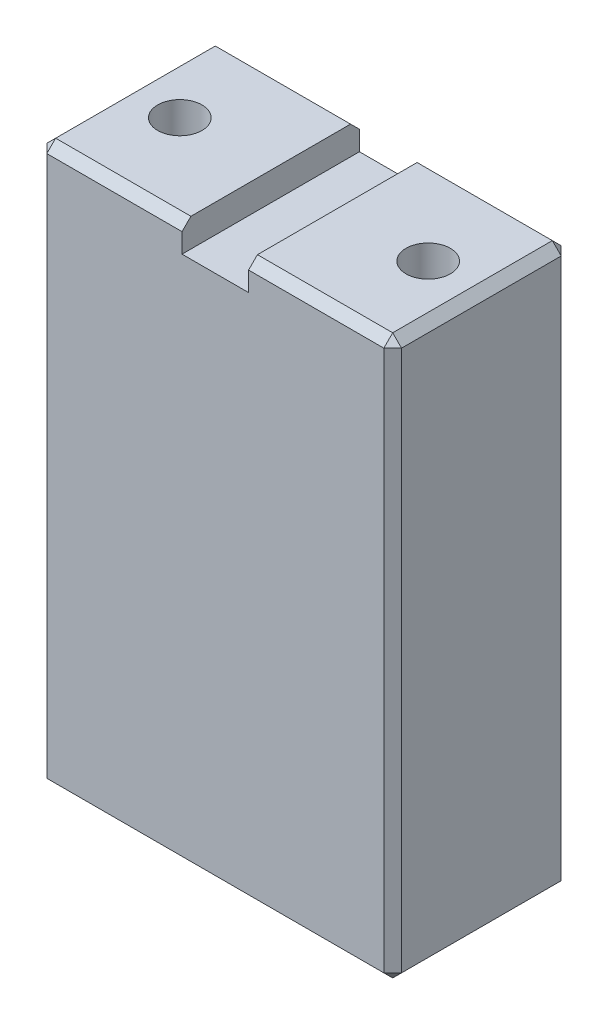
ISO-10303-21;
HEADER;
FILE_DESCRIPTION(('STEP AP214'),'2;1');
FILE_NAME('part.step','',(''),(''),'','','');
FILE_SCHEMA(('AUTOMOTIVE_DESIGN { 1 0 10303 214 1 1 1 1 }'));
ENDSEC;
DATA;
#1=APPLICATION_CONTEXT('core data for automotive mechanical design processes');
#2=APPLICATION_PROTOCOL_DEFINITION('international standard','automotive_design',2000,#1);
#3=PRODUCT_CONTEXT('',#1,'mechanical');
#4=PRODUCT('Part','Part','',(#3));
#5=PRODUCT_RELATED_PRODUCT_CATEGORY('part','',(#4));
#6=PRODUCT_DEFINITION_FORMATION('','',#4);
#7=PRODUCT_DEFINITION_CONTEXT('part definition',#1,'design');
#8=PRODUCT_DEFINITION('design','',#6,#7);
#9=PRODUCT_DEFINITION_SHAPE('','',#8);
#10=(LENGTH_UNIT() NAMED_UNIT(*) SI_UNIT(.MILLI.,.METRE.));
#11=(NAMED_UNIT(*) PLANE_ANGLE_UNIT() SI_UNIT($,.RADIAN.));
#12=(NAMED_UNIT(*) SI_UNIT($,.STERADIAN.) SOLID_ANGLE_UNIT());
#13=UNCERTAINTY_MEASURE_WITH_UNIT(LENGTH_MEASURE(1.E-05),#10,'distance_accuracy_value','');
#14=(GEOMETRIC_REPRESENTATION_CONTEXT(3) GLOBAL_UNCERTAINTY_ASSIGNED_CONTEXT((#13)) GLOBAL_UNIT_ASSIGNED_CONTEXT((#10,
#11,#12)) REPRESENTATION_CONTEXT('',''));
#15=CARTESIAN_POINT('',(0.,0.,0.));
#16=DIRECTION('',(0.,0.,1.));
#17=DIRECTION('',(1.,0.,0.));
#18=AXIS2_PLACEMENT_3D('',#15,#16,#17);
#19=CARTESIAN_POINT('',(-20.,31.5,20.));
#20=DIRECTION('',(0.,-1.,0.));
#21=DIRECTION('',(0.,0.,-1.));
#22=AXIS2_PLACEMENT_3D('',#19,#20,#21);
#23=PLANE('',#22);
#24=CARTESIAN_POINT('',(-14.,31.5,10.));
#25=DIRECTION('',(0.,1.,0.));
#26=DIRECTION('',(0.,0.,1.));
#27=AXIS2_PLACEMENT_3D('',#24,#25,#26);
#28=CIRCLE('',#27,2.5);
#29=CARTESIAN_POINT('',(-14.,31.5,12.5));
#30=VERTEX_POINT('',#29);
#31=EDGE_CURVE('E199',#30,#30,#28,.T.);
#32=ORIENTED_EDGE('',*,*,#31,.F.);
#33=EDGE_LOOP('',(#32));
#34=FACE_BOUND('',#33,.T.);
#35=DIRECTION('',(0.,0.,1.));
#36=VECTOR('',#35,1.);
#37=CARTESIAN_POINT('',(-3.75,31.5,0.));
#38=LINE('',#37,#36);
#39=CARTESIAN_POINT('',(-3.75,31.5,1.00000000000001));
#40=VERTEX_POINT('',#39);
#41=CARTESIAN_POINT('',(-3.75,31.5,19.));
#42=VERTEX_POINT('',#41);
#43=EDGE_CURVE('E221',#40,#42,#38,.T.);
#44=ORIENTED_EDGE('',*,*,#43,.F.);
#45=DIRECTION('',(-1.,0.,0.));
#46=VECTOR('',#45,1.);
#47=CARTESIAN_POINT('',(-20.,31.5,1.00000000000001));
#48=LINE('',#47,#46);
#49=CARTESIAN_POINT('',(-19.,31.5,1.00000000000001));
#50=VERTEX_POINT('',#49);
#51=EDGE_CURVE('E292',#40,#50,#48,.T.);
#52=ORIENTED_EDGE('',*,*,#51,.T.);
#53=DIRECTION('',(0.,0.,1.));
#54=VECTOR('',#53,1.);
#55=CARTESIAN_POINT('',(-19.,31.5,20.));
#56=LINE('',#55,#54);
#57=CARTESIAN_POINT('',(-19.,31.5,19.));
#58=VERTEX_POINT('',#57);
#59=EDGE_CURVE('E290',#50,#58,#56,.T.);
#60=ORIENTED_EDGE('',*,*,#59,.T.);
#61=DIRECTION('',(1.,0.,0.));
#62=VECTOR('',#61,1.);
#63=CARTESIAN_POINT('',(-20.,31.5,19.));
#64=LINE('',#63,#62);
#65=EDGE_CURVE('E288',#58,#42,#64,.T.);
#66=ORIENTED_EDGE('',*,*,#65,.T.);
#67=EDGE_LOOP('',(#44,#52,#60,#66));
#68=FACE_BOUND('',#67,.T.);
#69=ADVANCED_FACE('F53',(#34,#68),#23,.F.);
#70=CARTESIAN_POINT('',(20.,-31.5,20.));
#71=DIRECTION('',(-1.,0.,0.));
#72=DIRECTION('',(0.,0.,1.));
#73=AXIS2_PLACEMENT_3D('',#70,#71,#72);
#74=PLANE('',#73);
#75=DIRECTION('',(0.,-1.,0.));
#76=VECTOR('',#75,1.);
#77=CARTESIAN_POINT('',(20.,-31.5,19.));
#78=LINE('',#77,#76);
#79=CARTESIAN_POINT('',(20.,30.5,19.));
#80=VERTEX_POINT('',#79);
#81=CARTESIAN_POINT('',(20.,-30.5,19.));
#82=VERTEX_POINT('',#81);
#83=EDGE_CURVE('E279',#80,#82,#78,.T.);
#84=ORIENTED_EDGE('',*,*,#83,.T.);
#85=DIRECTION('',(0.,0.,-1.));
#86=VECTOR('',#85,1.);
#87=CARTESIAN_POINT('',(20.,-30.5,20.));
#88=LINE('',#87,#86);
#89=CARTESIAN_POINT('',(20.,-30.5,1.00000000000002));
#90=VERTEX_POINT('',#89);
#91=EDGE_CURVE('E285',#82,#90,#88,.T.);
#92=ORIENTED_EDGE('',*,*,#91,.T.);
#93=DIRECTION('',(0.,1.,0.));
#94=VECTOR('',#93,1.);
#95=CARTESIAN_POINT('',(20.,31.5,1.00000000000002));
#96=LINE('',#95,#94);
#97=CARTESIAN_POINT('',(20.,30.5,1.00000000000002));
#98=VERTEX_POINT('',#97);
#99=EDGE_CURVE('E283',#90,#98,#96,.T.);
#100=ORIENTED_EDGE('',*,*,#99,.T.);
#101=DIRECTION('',(0.,0.,1.));
#102=VECTOR('',#101,1.);
#103=CARTESIAN_POINT('',(20.,30.5,20.));
#104=LINE('',#103,#102);
#105=EDGE_CURVE('E281',#98,#80,#104,.T.);
#106=ORIENTED_EDGE('',*,*,#105,.T.);
#107=EDGE_LOOP('',(#84,#92,#100,#106));
#108=FACE_BOUND('',#107,.T.);
#109=ADVANCED_FACE('F392',(#108),#74,.F.);
#110=DIRECTION('',(0.,0.,-1.));
#111=VECTOR('',#110,1.);
#112=CARTESIAN_POINT('',(3.75,31.5,0.));
#113=LINE('',#112,#111);
#114=CARTESIAN_POINT('',(3.75,31.5,19.));
#115=VERTEX_POINT('',#114);
#116=CARTESIAN_POINT('',(3.75,31.5,1.00000000000001));
#117=VERTEX_POINT('',#116);
#118=EDGE_CURVE('E226',#115,#117,#113,.T.);
#119=ORIENTED_EDGE('',*,*,#118,.F.);
#120=DIRECTION('',(1.,0.,0.));
#121=VECTOR('',#120,1.);
#122=CARTESIAN_POINT('',(-20.,31.5,19.));
#123=LINE('',#122,#121);
#124=CARTESIAN_POINT('',(19.,31.5,19.));
#125=VERTEX_POINT('',#124);
#126=EDGE_CURVE('E11',#115,#125,#123,.T.);
#127=ORIENTED_EDGE('',*,*,#126,.T.);
#128=DIRECTION('',(0.,0.,-1.));
#129=VECTOR('',#128,1.);
#130=CARTESIAN_POINT('',(19.,31.5,20.));
#131=LINE('',#130,#129);
#132=CARTESIAN_POINT('',(19.,31.5,1.00000000000001));
#133=VERTEX_POINT('',#132);
#134=EDGE_CURVE('E70',#125,#133,#131,.T.);
#135=ORIENTED_EDGE('',*,*,#134,.T.);
#136=DIRECTION('',(-1.,0.,0.));
#137=VECTOR('',#136,1.);
#138=CARTESIAN_POINT('',(3.75,31.5,1.00000000000001));
#139=LINE('',#138,#137);
#140=EDGE_CURVE('E63',#133,#117,#139,.T.);
#141=ORIENTED_EDGE('',*,*,#140,.T.);
#142=EDGE_LOOP('',(#119,#127,#135,#141));
#143=FACE_BOUND('',#142,.T.);
#144=CARTESIAN_POINT('',(14.,31.5,10.));
#145=DIRECTION('',(0.,1.,0.));
#146=DIRECTION('',(0.,0.,1.));
#147=AXIS2_PLACEMENT_3D('',#144,#145,#146);
#148=CIRCLE('',#147,2.5);
#149=CARTESIAN_POINT('',(14.,31.5,12.5));
#150=VERTEX_POINT('',#149);
#151=EDGE_CURVE('E198',#150,#150,#148,.T.);
#152=ORIENTED_EDGE('',*,*,#151,.F.);
#153=EDGE_LOOP('',(#152));
#154=FACE_BOUND('',#153,.T.);
#155=ADVANCED_FACE('F418',(#143,#154),#23,.F.);
#156=CARTESIAN_POINT('',(-20.,-31.5,20.));
#157=DIRECTION('',(1.,0.,0.));
#158=DIRECTION('',(0.,0.,-1.));
#159=AXIS2_PLACEMENT_3D('',#156,#157,#158);
#160=PLANE('',#159);
#161=DIRECTION('',(0.,-1.,0.));
#162=VECTOR('',#161,1.);
#163=CARTESIAN_POINT('',(-20.,-31.5,1.00000000000001));
#164=LINE('',#163,#162);
#165=CARTESIAN_POINT('',(-20.,30.5,1.00000000000001));
#166=VERTEX_POINT('',#165);
#167=CARTESIAN_POINT('',(-20.,-30.5,1.00000000000001));
#168=VERTEX_POINT('',#167);
#169=EDGE_CURVE('E263',#166,#168,#164,.T.);
#170=ORIENTED_EDGE('',*,*,#169,.T.);
#171=DIRECTION('',(0.,0.,1.));
#172=VECTOR('',#171,1.);
#173=CARTESIAN_POINT('',(-20.,-30.5,20.));
#174=LINE('',#173,#172);
#175=CARTESIAN_POINT('',(-20.,-30.5,19.));
#176=VERTEX_POINT('',#175);
#177=EDGE_CURVE('E265',#168,#176,#174,.T.);
#178=ORIENTED_EDGE('',*,*,#177,.T.);
#179=DIRECTION('',(0.,1.,0.));
#180=VECTOR('',#179,1.);
#181=CARTESIAN_POINT('',(-20.,-31.5,19.));
#182=LINE('',#181,#180);
#183=CARTESIAN_POINT('',(-20.,30.5,19.));
#184=VERTEX_POINT('',#183);
#185=EDGE_CURVE('E259',#176,#184,#182,.T.);
#186=ORIENTED_EDGE('',*,*,#185,.T.);
#187=DIRECTION('',(0.,0.,-1.));
#188=VECTOR('',#187,1.);
#189=CARTESIAN_POINT('',(-20.,30.5,20.));
#190=LINE('',#189,#188);
#191=EDGE_CURVE('E261',#184,#166,#190,.T.);
#192=ORIENTED_EDGE('',*,*,#191,.T.);
#193=EDGE_LOOP('',(#170,#178,#186,#192));
#194=FACE_BOUND('',#193,.T.);
#195=ADVANCED_FACE('F481',(#194),#160,.F.);
#196=CARTESIAN_POINT('',(-20.,-31.5,20.));
#197=DIRECTION('',(0.,1.,0.));
#198=DIRECTION('',(0.,0.,1.));
#199=AXIS2_PLACEMENT_3D('',#196,#197,#198);
#200=PLANE('',#199);
#201=DIRECTION('',(-1.,0.,0.));
#202=VECTOR('',#201,1.);
#203=CARTESIAN_POINT('',(-20.,-31.5,19.));
#204=LINE('',#203,#202);
#205=CARTESIAN_POINT('',(19.,-31.5,19.));
#206=VERTEX_POINT('',#205);
#207=CARTESIAN_POINT('',(-19.,-31.5,19.));
#208=VERTEX_POINT('',#207);
#209=EDGE_CURVE('E242',#206,#208,#204,.T.);
#210=ORIENTED_EDGE('',*,*,#209,.T.);
#211=DIRECTION('',(0.,0.,-1.));
#212=VECTOR('',#211,1.);
#213=CARTESIAN_POINT('',(-19.,-31.5,20.));
#214=LINE('',#213,#212);
#215=CARTESIAN_POINT('',(-19.,-31.5,1.00000000000001));
#216=VERTEX_POINT('',#215);
#217=EDGE_CURVE('E256',#208,#216,#214,.T.);
#218=ORIENTED_EDGE('',*,*,#217,.T.);
#219=DIRECTION('',(1.,0.,0.));
#220=VECTOR('',#219,1.);
#221=CARTESIAN_POINT('',(20.,-31.5,1.00000000000001));
#222=LINE('',#221,#220);
#223=CARTESIAN_POINT('',(19.,-31.5,1.00000000000001));
#224=VERTEX_POINT('',#223);
#225=EDGE_CURVE('E254',#216,#224,#222,.T.);
#226=ORIENTED_EDGE('',*,*,#225,.T.);
#227=DIRECTION('',(0.,0.,1.));
#228=VECTOR('',#227,1.);
#229=CARTESIAN_POINT('',(19.,-31.5,20.));
#230=LINE('',#229,#228);
#231=EDGE_CURVE('E252',#224,#206,#230,.T.);
#232=ORIENTED_EDGE('',*,*,#231,.T.);
#233=EDGE_LOOP('',(#210,#218,#226,#232));
#234=FACE_BOUND('',#233,.T.);
#235=CARTESIAN_POINT('',(12.,-31.5,10.));
#236=DIRECTION('',(0.,-1.,0.));
#237=DIRECTION('',(0.,0.,-1.));
#238=AXIS2_PLACEMENT_3D('',#235,#236,#237);
#239=CIRCLE('',#238,3.39999999999999);
#240=CARTESIAN_POINT('',(12.,-31.5,6.60000000000002));
#241=VERTEX_POINT('',#240);
#242=EDGE_CURVE('E209',#241,#241,#239,.T.);
#243=ORIENTED_EDGE('',*,*,#242,.F.);
#244=EDGE_LOOP('',(#243));
#245=FACE_BOUND('',#244,.T.);
#246=CARTESIAN_POINT('',(-12.,-31.5,10.));
#247=DIRECTION('',(0.,-1.,0.));
#248=DIRECTION('',(0.,0.,-1.));
#249=AXIS2_PLACEMENT_3D('',#246,#247,#248);
#250=CIRCLE('',#249,3.39999999999999);
#251=CARTESIAN_POINT('',(-12.,-31.5,6.60000000000002));
#252=VERTEX_POINT('',#251);
#253=EDGE_CURVE('E215',#252,#252,#250,.T.);
#254=ORIENTED_EDGE('',*,*,#253,.F.);
#255=EDGE_LOOP('',(#254));
#256=FACE_BOUND('',#255,.T.);
#257=ADVANCED_FACE('F447',(#234,#245,#256),#200,.F.);
#258=CARTESIAN_POINT('',(0.,0.,20.));
#259=DIRECTION('',(0.,0.,-1.));
#260=DIRECTION('',(-1.,0.,0.));
#261=AXIS2_PLACEMENT_3D('',#258,#259,#260);
#262=PLANE('',#261);
#263=DIRECTION('',(0.,1.,0.));
#264=VECTOR('',#263,1.);
#265=CARTESIAN_POINT('',(-3.75,28.3,20.));
#266=LINE('',#265,#264);
#267=CARTESIAN_POINT('',(-3.75,28.3,20.));
#268=VERTEX_POINT('',#267);
#269=CARTESIAN_POINT('',(-3.75,30.5,20.));
#270=VERTEX_POINT('',#269);
#271=EDGE_CURVE('E234',#268,#270,#266,.T.);
#272=ORIENTED_EDGE('',*,*,#271,.T.);
#273=DIRECTION('',(-1.,0.,0.));
#274=VECTOR('',#273,1.);
#275=CARTESIAN_POINT('',(0.,30.5,20.));
#276=LINE('',#275,#274);
#277=CARTESIAN_POINT('',(-19.,30.5,20.));
#278=VERTEX_POINT('',#277);
#279=EDGE_CURVE('E306',#270,#278,#276,.T.);
#280=ORIENTED_EDGE('',*,*,#279,.T.);
#281=DIRECTION('',(0.,-1.,0.));
#282=VECTOR('',#281,1.);
#283=CARTESIAN_POINT('',(-19.,0.,20.));
#284=LINE('',#283,#282);
#285=CARTESIAN_POINT('',(-19.,-30.5,20.));
#286=VERTEX_POINT('',#285);
#287=EDGE_CURVE('E304',#278,#286,#284,.T.);
#288=ORIENTED_EDGE('',*,*,#287,.T.);
#289=DIRECTION('',(1.,0.,0.));
#290=VECTOR('',#289,1.);
#291=CARTESIAN_POINT('',(0.,-30.5,20.));
#292=LINE('',#291,#290);
#293=CARTESIAN_POINT('',(19.,-30.5,20.));
#294=VERTEX_POINT('',#293);
#295=EDGE_CURVE('E302',#286,#294,#292,.T.);
#296=ORIENTED_EDGE('',*,*,#295,.T.);
#297=DIRECTION('',(0.,1.,0.));
#298=VECTOR('',#297,1.);
#299=CARTESIAN_POINT('',(19.,0.,20.));
#300=LINE('',#299,#298);
#301=CARTESIAN_POINT('',(19.,30.5,20.));
#302=VERTEX_POINT('',#301);
#303=EDGE_CURVE('E298',#294,#302,#300,.T.);
#304=ORIENTED_EDGE('',*,*,#303,.T.);
#305=DIRECTION('',(-1.,0.,0.));
#306=VECTOR('',#305,1.);
#307=CARTESIAN_POINT('',(0.,30.5,20.));
#308=LINE('',#307,#306);
#309=CARTESIAN_POINT('',(3.75,30.5,20.));
#310=VERTEX_POINT('',#309);
#311=EDGE_CURVE('E300',#302,#310,#308,.T.);
#312=ORIENTED_EDGE('',*,*,#311,.T.);
#313=DIRECTION('',(0.,1.,0.));
#314=VECTOR('',#313,1.);
#315=CARTESIAN_POINT('',(3.75,28.3,20.));
#316=LINE('',#315,#314);
#317=CARTESIAN_POINT('',(3.75,28.3,20.));
#318=VERTEX_POINT('',#317);
#319=EDGE_CURVE('E246',#318,#310,#316,.T.);
#320=ORIENTED_EDGE('',*,*,#319,.F.);
#321=DIRECTION('',(1.,0.,0.));
#322=VECTOR('',#321,1.);
#323=CARTESIAN_POINT('',(-3.75,28.3,20.));
#324=LINE('',#323,#322);
#325=EDGE_CURVE('E225',#268,#318,#324,.T.);
#326=ORIENTED_EDGE('',*,*,#325,.F.);
#327=EDGE_LOOP('',(#272,#280,#288,#296,#304,#312,#320,#326));
#328=FACE_BOUND('',#327,.T.);
#329=ADVANCED_FACE('F426',(#328),#262,.F.);
#330=CARTESIAN_POINT('',(0.,0.,0.));
#331=DIRECTION('',(0.,0.,-1.));
#332=DIRECTION('',(-1.,0.,0.));
#333=AXIS2_PLACEMENT_3D('',#330,#331,#332);
#334=PLANE('',#333);
#335=DIRECTION('',(0.,1.,0.));
#336=VECTOR('',#335,1.);
#337=CARTESIAN_POINT('',(-19.,31.5,0.));
#338=LINE('',#337,#336);
#339=CARTESIAN_POINT('',(-19.,-30.5,0.));
#340=VERTEX_POINT('',#339);
#341=CARTESIAN_POINT('',(-19.,30.5,0.));
#342=VERTEX_POINT('',#341);
#343=EDGE_CURVE('E274',#340,#342,#338,.T.);
#344=ORIENTED_EDGE('',*,*,#343,.T.);
#345=DIRECTION('',(1.,0.,0.));
#346=VECTOR('',#345,1.);
#347=CARTESIAN_POINT('',(-3.75,30.5,0.));
#348=LINE('',#347,#346);
#349=CARTESIAN_POINT('',(-3.75,30.5,0.));
#350=VERTEX_POINT('',#349);
#351=EDGE_CURVE('E277',#342,#350,#348,.T.);
#352=ORIENTED_EDGE('',*,*,#351,.T.);
#353=DIRECTION('',(0.,1.,0.));
#354=VECTOR('',#353,1.);
#355=CARTESIAN_POINT('',(-3.75,28.3,0.));
#356=LINE('',#355,#354);
#357=CARTESIAN_POINT('',(-3.75,28.3,0.));
#358=VERTEX_POINT('',#357);
#359=EDGE_CURVE('E239',#358,#350,#356,.T.);
#360=ORIENTED_EDGE('',*,*,#359,.F.);
#361=DIRECTION('',(-1.,0.,0.));
#362=VECTOR('',#361,1.);
#363=CARTESIAN_POINT('',(-3.75,28.3,0.));
#364=LINE('',#363,#362);
#365=CARTESIAN_POINT('',(3.75,28.3,0.));
#366=VERTEX_POINT('',#365);
#367=EDGE_CURVE('E231',#366,#358,#364,.T.);
#368=ORIENTED_EDGE('',*,*,#367,.F.);
#369=DIRECTION('',(0.,1.,0.));
#370=VECTOR('',#369,1.);
#371=CARTESIAN_POINT('',(3.75,28.3,0.));
#372=LINE('',#371,#370);
#373=CARTESIAN_POINT('',(3.75,30.5,0.));
#374=VERTEX_POINT('',#373);
#375=EDGE_CURVE('E243',#366,#374,#372,.T.);
#376=ORIENTED_EDGE('',*,*,#375,.T.);
#377=DIRECTION('',(1.,0.,0.));
#378=VECTOR('',#377,1.);
#379=CARTESIAN_POINT('',(20.,30.5,0.));
#380=LINE('',#379,#378);
#381=CARTESIAN_POINT('',(19.,30.5,0.));
#382=VERTEX_POINT('',#381);
#383=EDGE_CURVE('E270',#374,#382,#380,.T.);
#384=ORIENTED_EDGE('',*,*,#383,.T.);
#385=DIRECTION('',(0.,-1.,0.));
#386=VECTOR('',#385,1.);
#387=CARTESIAN_POINT('',(19.,-31.5,0.));
#388=LINE('',#387,#386);
#389=CARTESIAN_POINT('',(19.,-30.5,0.));
#390=VERTEX_POINT('',#389);
#391=EDGE_CURVE('E268',#382,#390,#388,.T.);
#392=ORIENTED_EDGE('',*,*,#391,.T.);
#393=DIRECTION('',(-1.,0.,0.));
#394=VECTOR('',#393,1.);
#395=CARTESIAN_POINT('',(-20.,-30.5,0.));
#396=LINE('',#395,#394);
#397=EDGE_CURVE('E272',#390,#340,#396,.T.);
#398=ORIENTED_EDGE('',*,*,#397,.T.);
#399=EDGE_LOOP('',(#344,#352,#360,#368,#376,#384,#392,#398));
#400=FACE_BOUND('',#399,.T.);
#401=ADVANCED_FACE('F491',(#400),#334,.T.);
#402=CARTESIAN_POINT('',(-3.75,28.3,0.));
#403=DIRECTION('',(-1.,0.,0.));
#404=DIRECTION('',(0.,0.,1.));
#405=AXIS2_PLACEMENT_3D('',#402,#403,#404);
#406=PLANE('',#405);
#407=ORIENTED_EDGE('',*,*,#359,.T.);
#408=DIRECTION('',(0.,0.70710678118655,0.707106781186545));
#409=VECTOR('',#408,1.);
#410=CARTESIAN_POINT('',(-3.75,31.5,1.00000000000001));
#411=LINE('',#410,#409);
#412=EDGE_CURVE('E296',#350,#40,#411,.T.);
#413=ORIENTED_EDGE('',*,*,#412,.T.);
#414=ORIENTED_EDGE('',*,*,#43,.T.);
#415=DIRECTION('',(0.,0.707106781186545,-0.70710678118655));
#416=VECTOR('',#415,1.);
#417=CARTESIAN_POINT('',(-3.75,30.5,20.));
#418=LINE('',#417,#416);
#419=EDGE_CURVE('E294',#42,#270,#418,.F.);
#420=ORIENTED_EDGE('',*,*,#419,.T.);
#421=ORIENTED_EDGE('',*,*,#271,.F.);
#422=DIRECTION('',(0.,0.,1.));
#423=VECTOR('',#422,1.);
#424=CARTESIAN_POINT('',(-3.75,28.3,0.));
#425=LINE('',#424,#423);
#426=EDGE_CURVE('E222',#358,#268,#425,.T.);
#427=ORIENTED_EDGE('',*,*,#426,.F.);
#428=EDGE_LOOP('',(#407,#413,#414,#420,#421,#427));
#429=FACE_BOUND('',#428,.T.);
#430=ADVANCED_FACE('F494',(#429),#406,.F.);
#431=CARTESIAN_POINT('',(3.75,28.3,0.));
#432=DIRECTION('',(1.,0.,0.));
#433=DIRECTION('',(0.,0.,-1.));
#434=AXIS2_PLACEMENT_3D('',#431,#432,#433);
#435=PLANE('',#434);
#436=ORIENTED_EDGE('',*,*,#319,.T.);
#437=DIRECTION('',(0.,-0.707106781186545,0.70710678118655));
#438=VECTOR('',#437,1.);
#439=CARTESIAN_POINT('',(3.75,30.5,20.));
#440=LINE('',#439,#438);
#441=EDGE_CURVE('E310',#310,#115,#440,.F.);
#442=ORIENTED_EDGE('',*,*,#441,.T.);
#443=ORIENTED_EDGE('',*,*,#118,.T.);
#444=DIRECTION('',(0.,-0.70710678118655,-0.707106781186545));
#445=VECTOR('',#444,1.);
#446=CARTESIAN_POINT('',(3.75,31.5,1.00000000000001));
#447=LINE('',#446,#445);
#448=EDGE_CURVE('E308',#117,#374,#447,.T.);
#449=ORIENTED_EDGE('',*,*,#448,.T.);
#450=ORIENTED_EDGE('',*,*,#375,.F.);
#451=DIRECTION('',(0.,0.,-1.));
#452=VECTOR('',#451,1.);
#453=CARTESIAN_POINT('',(3.75,28.3,0.));
#454=LINE('',#453,#452);
#455=EDGE_CURVE('E229',#318,#366,#454,.T.);
#456=ORIENTED_EDGE('',*,*,#455,.F.);
#457=EDGE_LOOP('',(#436,#442,#443,#449,#450,#456));
#458=FACE_BOUND('',#457,.T.);
#459=ADVANCED_FACE('F421',(#458),#435,.F.);
#460=CARTESIAN_POINT('',(0.,28.3,0.));
#461=DIRECTION('',(0.,1.,0.));
#462=DIRECTION('',(0.,0.,1.));
#463=AXIS2_PLACEMENT_3D('',#460,#461,#462);
#464=PLANE('',#463);
#465=ORIENTED_EDGE('',*,*,#426,.T.);
#466=ORIENTED_EDGE('',*,*,#325,.T.);
#467=ORIENTED_EDGE('',*,*,#455,.T.);
#468=ORIENTED_EDGE('',*,*,#367,.T.);
#469=EDGE_LOOP('',(#465,#466,#467,#468));
#470=FACE_BOUND('',#469,.T.);
#471=ADVANCED_FACE('F503',(#470),#464,.T.);
#472=CARTESIAN_POINT('',(-12.,-11.75,10.));
#473=DIRECTION('',(0.,-1.,0.));
#474=DIRECTION('',(0.,0.,-1.));
#475=AXIS2_PLACEMENT_3D('',#472,#473,#474);
#476=CONICAL_SURFACE('',#475,3.39999999999999,1.02974425867665);
#477=CARTESIAN_POINT('',(-12.,-9.70707389530629,10.));
#478=VERTEX_POINT('',#477);
#479=VERTEX_LOOP('',#478);
#480=FACE_BOUND('',#479,.T.);
#481=CARTESIAN_POINT('',(-12.,-11.75,10.));
#482=DIRECTION('',(0.,-1.,0.));
#483=DIRECTION('',(0.,0.,-1.));
#484=AXIS2_PLACEMENT_3D('',#481,#482,#483);
#485=CIRCLE('',#484,3.39999999999999);
#486=CARTESIAN_POINT('',(-12.,-11.75,6.60000000000002));
#487=VERTEX_POINT('',#486);
#488=EDGE_CURVE('E218',#487,#487,#485,.T.);
#489=ORIENTED_EDGE('',*,*,#488,.T.);
#490=EDGE_LOOP('',(#489));
#491=FACE_BOUND('',#490,.T.);
#492=ADVANCED_FACE('F506',(#480,#491),#476,.F.);
#493=CARTESIAN_POINT('',(-12.,-31.5,10.));
#494=DIRECTION('',(0.,-1.,0.));
#495=DIRECTION('',(0.,0.,-1.));
#496=AXIS2_PLACEMENT_3D('',#493,#494,#495);
#497=CYLINDRICAL_SURFACE('',#496,3.39999999999999);
#498=ORIENTED_EDGE('',*,*,#488,.F.);
#499=EDGE_LOOP('',(#498));
#500=FACE_BOUND('',#499,.T.);
#501=ORIENTED_EDGE('',*,*,#253,.T.);
#502=EDGE_LOOP('',(#501));
#503=FACE_BOUND('',#502,.T.);
#504=ADVANCED_FACE('F510',(#500,#503),#497,.F.);
#505=CARTESIAN_POINT('',(12.,-11.75,10.));
#506=DIRECTION('',(0.,-1.,0.));
#507=DIRECTION('',(0.,0.,-1.));
#508=AXIS2_PLACEMENT_3D('',#505,#506,#507);
#509=CONICAL_SURFACE('',#508,3.39999999999999,1.02974425867665);
#510=CARTESIAN_POINT('',(12.,-9.70707389530629,10.));
#511=VERTEX_POINT('',#510);
#512=VERTEX_LOOP('',#511);
#513=FACE_BOUND('',#512,.T.);
#514=CARTESIAN_POINT('',(12.,-11.75,10.));
#515=DIRECTION('',(0.,-1.,0.));
#516=DIRECTION('',(0.,0.,-1.));
#517=AXIS2_PLACEMENT_3D('',#514,#515,#516);
#518=CIRCLE('',#517,3.39999999999999);
#519=CARTESIAN_POINT('',(12.,-11.75,6.60000000000002));
#520=VERTEX_POINT('',#519);
#521=EDGE_CURVE('E212',#520,#520,#518,.T.);
#522=ORIENTED_EDGE('',*,*,#521,.T.);
#523=EDGE_LOOP('',(#522));
#524=FACE_BOUND('',#523,.T.);
#525=ADVANCED_FACE('F514',(#513,#524),#509,.F.);
#526=CARTESIAN_POINT('',(12.,-31.5,10.));
#527=DIRECTION('',(0.,-1.,0.));
#528=DIRECTION('',(0.,0.,-1.));
#529=AXIS2_PLACEMENT_3D('',#526,#527,#528);
#530=CYLINDRICAL_SURFACE('',#529,3.39999999999999);
#531=ORIENTED_EDGE('',*,*,#521,.F.);
#532=EDGE_LOOP('',(#531));
#533=FACE_BOUND('',#532,.T.);
#534=ORIENTED_EDGE('',*,*,#242,.T.);
#535=EDGE_LOOP('',(#534));
#536=FACE_BOUND('',#535,.T.);
#537=ADVANCED_FACE('F518',(#533,#536),#530,.F.);
#538=CARTESIAN_POINT('',(14.,16.5,10.));
#539=DIRECTION('',(0.,1.,0.));
#540=DIRECTION('',(0.,0.,1.));
#541=AXIS2_PLACEMENT_3D('',#538,#539,#540);
#542=CONICAL_SURFACE('',#541,2.5,1.02974425867665);
#543=CARTESIAN_POINT('',(14.,14.9978484524311,10.));
#544=VERTEX_POINT('',#543);
#545=VERTEX_LOOP('',#544);
#546=FACE_BOUND('',#545,.T.);
#547=CARTESIAN_POINT('',(14.,16.5,10.));
#548=DIRECTION('',(0.,1.,0.));
#549=DIRECTION('',(0.,0.,1.));
#550=AXIS2_PLACEMENT_3D('',#547,#548,#549);
#551=CIRCLE('',#550,2.5);
#552=CARTESIAN_POINT('',(14.,16.5,12.5));
#553=VERTEX_POINT('',#552);
#554=EDGE_CURVE('E202',#553,#553,#551,.T.);
#555=ORIENTED_EDGE('',*,*,#554,.T.);
#556=EDGE_LOOP('',(#555));
#557=FACE_BOUND('',#556,.T.);
#558=ADVANCED_FACE('F522',(#546,#557),#542,.F.);
#559=CARTESIAN_POINT('',(14.,31.5,10.));
#560=DIRECTION('',(0.,1.,0.));
#561=DIRECTION('',(0.,0.,1.));
#562=AXIS2_PLACEMENT_3D('',#559,#560,#561);
#563=CYLINDRICAL_SURFACE('',#562,2.5);
#564=ORIENTED_EDGE('',*,*,#554,.F.);
#565=EDGE_LOOP('',(#564));
#566=FACE_BOUND('',#565,.T.);
#567=ORIENTED_EDGE('',*,*,#151,.T.);
#568=EDGE_LOOP('',(#567));
#569=FACE_BOUND('',#568,.T.);
#570=ADVANCED_FACE('F192',(#566,#569),#563,.F.);
#571=CARTESIAN_POINT('',(-14.,16.5,10.));
#572=DIRECTION('',(0.,1.,0.));
#573=DIRECTION('',(0.,0.,1.));
#574=AXIS2_PLACEMENT_3D('',#571,#572,#573);
#575=CONICAL_SURFACE('',#574,2.5,1.02974425867665);
#576=CARTESIAN_POINT('',(-14.,14.9978484524311,10.));
#577=VERTEX_POINT('',#576);
#578=VERTEX_LOOP('',#577);
#579=FACE_BOUND('',#578,.T.);
#580=CARTESIAN_POINT('',(-14.,16.5,10.));
#581=DIRECTION('',(0.,1.,0.));
#582=DIRECTION('',(0.,0.,1.));
#583=AXIS2_PLACEMENT_3D('',#580,#581,#582);
#584=CIRCLE('',#583,2.5);
#585=CARTESIAN_POINT('',(-14.,16.5,12.5));
#586=VERTEX_POINT('',#585);
#587=EDGE_CURVE('E196',#586,#586,#584,.T.);
#588=ORIENTED_EDGE('',*,*,#587,.T.);
#589=EDGE_LOOP('',(#588));
#590=FACE_BOUND('',#589,.T.);
#591=ADVANCED_FACE('F188',(#579,#590),#575,.F.);
#592=CARTESIAN_POINT('',(-14.,31.5,10.));
#593=DIRECTION('',(0.,1.,0.));
#594=DIRECTION('',(0.,0.,1.));
#595=AXIS2_PLACEMENT_3D('',#592,#593,#594);
#596=CYLINDRICAL_SURFACE('',#595,2.5);
#597=ORIENTED_EDGE('',*,*,#587,.F.);
#598=EDGE_LOOP('',(#597));
#599=FACE_BOUND('',#598,.T.);
#600=ORIENTED_EDGE('',*,*,#31,.T.);
#601=EDGE_LOOP('',(#600));
#602=FACE_BOUND('',#601,.T.);
#603=ADVANCED_FACE('F191',(#599,#602),#596,.F.);
#604=CARTESIAN_POINT('',(0.,30.5,20.));
#605=DIRECTION('',(0.,-0.70710678118655,-0.707106781186545));
#606=DIRECTION('',(-1.,0.,0.));
#607=AXIS2_PLACEMENT_3D('',#604,#605,#606);
#608=PLANE('',#607);
#609=ORIENTED_EDGE('',*,*,#441,.F.);
#610=ORIENTED_EDGE('',*,*,#311,.F.);
#611=DIRECTION('',(0.,0.707106781186545,-0.70710678118655));
#612=VECTOR('',#611,1.);
#613=CARTESIAN_POINT('',(19.,31.5,19.));
#614=LINE('',#613,#612);
#615=EDGE_CURVE('E58',#125,#302,#614,.F.);
#616=ORIENTED_EDGE('',*,*,#615,.F.);
#617=ORIENTED_EDGE('',*,*,#126,.F.);
#618=EDGE_LOOP('',(#609,#610,#616,#617));
#619=FACE_BOUND('',#618,.T.);
#620=ADVANCED_FACE('F56',(#619),#608,.F.);
#621=CARTESIAN_POINT('',(19.,31.5,20.));
#622=DIRECTION('',(-0.707106781186551,-0.707106781186544,0.));
#623=DIRECTION('',(0.,0.,-1.));
#624=AXIS2_PLACEMENT_3D('',#621,#622,#623);
#625=PLANE('',#624);
#626=DIRECTION('',(-0.707106781186544,0.707106781186551,0.));
#627=VECTOR('',#626,1.);
#628=CARTESIAN_POINT('',(19.5,31.,1.00000000000002));
#629=LINE('',#628,#627);
#630=EDGE_CURVE('E373',#133,#98,#629,.F.);
#631=ORIENTED_EDGE('',*,*,#630,.F.);
#632=ORIENTED_EDGE('',*,*,#134,.F.);
#633=DIRECTION('',(0.707106781186544,-0.707106781186551,0.));
#634=VECTOR('',#633,1.);
#635=CARTESIAN_POINT('',(19.,31.5,19.));
#636=LINE('',#635,#634);
#637=EDGE_CURVE('E375',#80,#125,#636,.F.);
#638=ORIENTED_EDGE('',*,*,#637,.F.);
#639=ORIENTED_EDGE('',*,*,#105,.F.);
#640=EDGE_LOOP('',(#631,#632,#638,#639));
#641=FACE_BOUND('',#640,.T.);
#642=ADVANCED_FACE('F410',(#641),#625,.F.);
#643=CARTESIAN_POINT('',(-20.,31.5,1.00000000000001));
#644=DIRECTION('',(0.,0.707106781186545,-0.70710678118655));
#645=DIRECTION('',(1.,0.,0.));
#646=AXIS2_PLACEMENT_3D('',#643,#644,#645);
#647=PLANE('',#646);
#648=ORIENTED_EDGE('',*,*,#448,.F.);
#649=ORIENTED_EDGE('',*,*,#140,.F.);
#650=DIRECTION('',(0.,0.70710678118655,0.707106781186545));
#651=VECTOR('',#650,1.);
#652=CARTESIAN_POINT('',(19.,30.5,0.));
#653=LINE('',#652,#651);
#654=EDGE_CURVE('E370',#382,#133,#653,.T.);
#655=ORIENTED_EDGE('',*,*,#654,.F.);
#656=ORIENTED_EDGE('',*,*,#383,.F.);
#657=EDGE_LOOP('',(#648,#649,#655,#656));
#658=FACE_BOUND('',#657,.T.);
#659=ADVANCED_FACE('F417',(#658),#647,.T.);
#660=CARTESIAN_POINT('',(19.,31.5,19.));
#661=DIRECTION('',(0.577350269189631,0.577350269189625,0.577350269189622));
#662=DIRECTION('',(-0.707106781186544,0.707106781186551,0.));
#663=AXIS2_PLACEMENT_3D('',#660,#661,#662);
#664=PLANE('',#663);
#665=ORIENTED_EDGE('',*,*,#637,.T.);
#666=ORIENTED_EDGE('',*,*,#615,.T.);
#667=DIRECTION('',(-0.707106781186545,0.,0.70710678118655));
#668=VECTOR('',#667,1.);
#669=CARTESIAN_POINT('',(19.5,30.5,19.5));
#670=LINE('',#669,#668);
#671=EDGE_CURVE('E367',#80,#302,#670,.T.);
#672=ORIENTED_EDGE('',*,*,#671,.F.);
#673=EDGE_LOOP('',(#665,#666,#672));
#674=FACE_BOUND('',#673,.T.);
#675=ADVANCED_FACE('F382',(#674),#664,.T.);
#676=CARTESIAN_POINT('',(19.,30.5,0.));
#677=DIRECTION('',(0.577350269189631,0.577350269189621,-0.577350269189626));
#678=DIRECTION('',(-0.707106781186545,0.,-0.70710678118655));
#679=AXIS2_PLACEMENT_3D('',#676,#677,#678);
#680=PLANE('',#679);
#681=ORIENTED_EDGE('',*,*,#654,.T.);
#682=ORIENTED_EDGE('',*,*,#630,.T.);
#683=DIRECTION('',(-0.707106781186545,0.,-0.70710678118655));
#684=VECTOR('',#683,1.);
#685=CARTESIAN_POINT('',(19.,30.5,0.));
#686=LINE('',#685,#684);
#687=EDGE_CURVE('E364',#382,#98,#686,.F.);
#688=ORIENTED_EDGE('',*,*,#687,.F.);
#689=EDGE_LOOP('',(#681,#682,#688));
#690=FACE_BOUND('',#689,.T.);
#691=ADVANCED_FACE('F412',(#690),#680,.T.);
#692=CARTESIAN_POINT('',(0.,30.5,20.));
#693=DIRECTION('',(0.,-0.70710678118655,-0.707106781186545));
#694=DIRECTION('',(-1.,0.,0.));
#695=AXIS2_PLACEMENT_3D('',#692,#693,#694);
#696=PLANE('',#695);
#697=ORIENTED_EDGE('',*,*,#419,.F.);
#698=ORIENTED_EDGE('',*,*,#65,.F.);
#699=DIRECTION('',(0.,-0.707106781186545,0.70710678118655));
#700=VECTOR('',#699,1.);
#701=CARTESIAN_POINT('',(-19.,31.5,19.));
#702=LINE('',#701,#700);
#703=EDGE_CURVE('E358',#278,#58,#702,.F.);
#704=ORIENTED_EDGE('',*,*,#703,.F.);
#705=ORIENTED_EDGE('',*,*,#279,.F.);
#706=EDGE_LOOP('',(#697,#698,#704,#705));
#707=FACE_BOUND('',#706,.T.);
#708=ADVANCED_FACE('F560',(#707),#696,.F.);
#709=CARTESIAN_POINT('',(19.,0.,20.));
#710=DIRECTION('',(-0.70710678118655,0.,-0.707106781186545));
#711=DIRECTION('',(0.,1.,0.));
#712=AXIS2_PLACEMENT_3D('',#709,#710,#711);
#713=PLANE('',#712);
#714=ORIENTED_EDGE('',*,*,#671,.T.);
#715=ORIENTED_EDGE('',*,*,#303,.F.);
#716=DIRECTION('',(0.707106781186545,0.,-0.70710678118655));
#717=VECTOR('',#716,1.);
#718=CARTESIAN_POINT('',(19.5,-30.5,19.5));
#719=LINE('',#718,#717);
#720=EDGE_CURVE('E355',#82,#294,#719,.F.);
#721=ORIENTED_EDGE('',*,*,#720,.F.);
#722=ORIENTED_EDGE('',*,*,#83,.F.);
#723=EDGE_LOOP('',(#714,#715,#721,#722));
#724=FACE_BOUND('',#723,.T.);
#725=ADVANCED_FACE('F388',(#724),#713,.F.);
#726=CARTESIAN_POINT('',(20.,-30.5,20.));
#727=DIRECTION('',(-0.707106781186551,0.707106781186544,0.));
#728=DIRECTION('',(0.,0.,-1.));
#729=AXIS2_PLACEMENT_3D('',#726,#727,#728);
#730=PLANE('',#729);
#731=DIRECTION('',(0.707106781186544,0.707106781186551,0.));
#732=VECTOR('',#731,1.);
#733=CARTESIAN_POINT('',(19.,-31.5,1.00000000000001));
#734=LINE('',#733,#732);
#735=EDGE_CURVE('E349',#90,#224,#734,.F.);
#736=ORIENTED_EDGE('',*,*,#735,.F.);
#737=ORIENTED_EDGE('',*,*,#91,.F.);
#738=DIRECTION('',(-0.707106781186544,-0.707106781186551,0.));
#739=VECTOR('',#738,1.);
#740=CARTESIAN_POINT('',(19.,-31.5,19.));
#741=LINE('',#740,#739);
#742=EDGE_CURVE('E352',#206,#82,#741,.F.);
#743=ORIENTED_EDGE('',*,*,#742,.F.);
#744=ORIENTED_EDGE('',*,*,#231,.F.);
#745=EDGE_LOOP('',(#736,#737,#743,#744));
#746=FACE_BOUND('',#745,.T.);
#747=ADVANCED_FACE('F397',(#746),#730,.F.);
#748=CARTESIAN_POINT('',(20.,-31.5,1.00000000000002));
#749=DIRECTION('',(0.70710678118655,0.,-0.707106781186545));
#750=DIRECTION('',(0.,-1.,0.));
#751=AXIS2_PLACEMENT_3D('',#748,#749,#750);
#752=PLANE('',#751);
#753=ORIENTED_EDGE('',*,*,#687,.T.);
#754=ORIENTED_EDGE('',*,*,#99,.F.);
#755=DIRECTION('',(0.707106781186545,0.,0.70710678118655));
#756=VECTOR('',#755,1.);
#757=CARTESIAN_POINT('',(19.5,-30.5,0.500000000000012));
#758=LINE('',#757,#756);
#759=EDGE_CURVE('E347',#390,#90,#758,.T.);
#760=ORIENTED_EDGE('',*,*,#759,.F.);
#761=ORIENTED_EDGE('',*,*,#391,.F.);
#762=EDGE_LOOP('',(#753,#754,#760,#761));
#763=FACE_BOUND('',#762,.T.);
#764=ADVANCED_FACE('F405',(#763),#752,.T.);
#765=CARTESIAN_POINT('',(-20.,31.5,1.00000000000001));
#766=DIRECTION('',(0.,0.707106781186545,-0.70710678118655));
#767=DIRECTION('',(1.,0.,0.));
#768=AXIS2_PLACEMENT_3D('',#765,#766,#767);
#769=PLANE('',#768);
#770=ORIENTED_EDGE('',*,*,#412,.F.);
#771=ORIENTED_EDGE('',*,*,#351,.F.);
#772=DIRECTION('',(0.,-0.70710678118655,-0.707106781186545));
#773=VECTOR('',#772,1.);
#774=CARTESIAN_POINT('',(-19.,30.5,0.));
#775=LINE('',#774,#773);
#776=EDGE_CURVE('E344',#50,#342,#775,.T.);
#777=ORIENTED_EDGE('',*,*,#776,.F.);
#778=ORIENTED_EDGE('',*,*,#51,.F.);
#779=EDGE_LOOP('',(#770,#771,#777,#778));
#780=FACE_BOUND('',#779,.T.);
#781=ADVANCED_FACE('F582',(#780),#769,.T.);
#782=CARTESIAN_POINT('',(-20.,30.5,20.));
#783=DIRECTION('',(0.707106781186545,-0.70710678118655,0.));
#784=DIRECTION('',(0.,0.,-1.));
#785=AXIS2_PLACEMENT_3D('',#782,#783,#784);
#786=PLANE('',#785);
#787=DIRECTION('',(0.70710678118655,0.707106781186545,0.));
#788=VECTOR('',#787,1.);
#789=CARTESIAN_POINT('',(-19.,31.5,19.));
#790=LINE('',#789,#788);
#791=EDGE_CURVE('E361',#58,#184,#790,.F.);
#792=ORIENTED_EDGE('',*,*,#791,.F.);
#793=ORIENTED_EDGE('',*,*,#59,.F.);
#794=DIRECTION('',(-0.70710678118655,-0.707106781186545,0.));
#795=VECTOR('',#794,1.);
#796=CARTESIAN_POINT('',(-19.5,31.,1.00000000000001));
#797=LINE('',#796,#795);
#798=EDGE_CURVE('E341',#166,#50,#797,.F.);
#799=ORIENTED_EDGE('',*,*,#798,.F.);
#800=ORIENTED_EDGE('',*,*,#191,.F.);
#801=EDGE_LOOP('',(#792,#793,#799,#800));
#802=FACE_BOUND('',#801,.T.);
#803=ADVANCED_FACE('F588',(#802),#786,.F.);
#804=CARTESIAN_POINT('',(-19.,31.5,19.));
#805=DIRECTION('',(-0.577350269189626,0.57735026918963,0.577350269189622));
#806=DIRECTION('',(-0.70710678118655,-0.707106781186545,0.));
#807=AXIS2_PLACEMENT_3D('',#804,#805,#806);
#808=PLANE('',#807);
#809=ORIENTED_EDGE('',*,*,#703,.T.);
#810=ORIENTED_EDGE('',*,*,#791,.T.);
#811=DIRECTION('',(-0.707106781186545,0.,-0.70710678118655));
#812=VECTOR('',#811,1.);
#813=CARTESIAN_POINT('',(-19.5,30.5,19.5));
#814=LINE('',#813,#812);
#815=EDGE_CURVE('E338',#278,#184,#814,.T.);
#816=ORIENTED_EDGE('',*,*,#815,.F.);
#817=EDGE_LOOP('',(#809,#810,#816));
#818=FACE_BOUND('',#817,.T.);
#819=ADVANCED_FACE('F465',(#818),#808,.T.);
#820=CARTESIAN_POINT('',(19.,-31.5,19.));
#821=DIRECTION('',(0.577350269189631,-0.577350269189625,0.577350269189622));
#822=DIRECTION('',(0.707106781186544,0.707106781186551,0.));
#823=AXIS2_PLACEMENT_3D('',#820,#821,#822);
#824=PLANE('',#823);
#825=ORIENTED_EDGE('',*,*,#742,.T.);
#826=ORIENTED_EDGE('',*,*,#720,.T.);
#827=DIRECTION('',(0.,0.707106781186545,0.70710678118655));
#828=VECTOR('',#827,1.);
#829=CARTESIAN_POINT('',(19.,-31.5,19.));
#830=LINE('',#829,#828);
#831=EDGE_CURVE('E335',#206,#294,#830,.T.);
#832=ORIENTED_EDGE('',*,*,#831,.F.);
#833=EDGE_LOOP('',(#825,#826,#832));
#834=FACE_BOUND('',#833,.T.);
#835=ADVANCED_FACE('F457',(#834),#824,.T.);
#836=CARTESIAN_POINT('',(19.,-31.5,1.00000000000001));
#837=DIRECTION('',(0.577350269189631,-0.57735026918962,-0.577350269189626));
#838=DIRECTION('',(-0.707106781186545,0.,-0.70710678118655));
#839=AXIS2_PLACEMENT_3D('',#836,#837,#838);
#840=PLANE('',#839);
#841=ORIENTED_EDGE('',*,*,#759,.T.);
#842=ORIENTED_EDGE('',*,*,#735,.T.);
#843=DIRECTION('',(0.,0.70710678118655,-0.707106781186545));
#844=VECTOR('',#843,1.);
#845=CARTESIAN_POINT('',(19.,-31.5,1.00000000000001));
#846=LINE('',#845,#844);
#847=EDGE_CURVE('E332',#390,#224,#846,.F.);
#848=ORIENTED_EDGE('',*,*,#847,.F.);
#849=EDGE_LOOP('',(#841,#842,#848));
#850=FACE_BOUND('',#849,.T.);
#851=ADVANCED_FACE('F454',(#850),#840,.T.);
#852=CARTESIAN_POINT('',(-19.,30.5,0.));
#853=DIRECTION('',(-0.577350269189622,0.577350269189626,-0.57735026918963));
#854=DIRECTION('',(0.,0.70710678118655,0.707106781186545));
#855=AXIS2_PLACEMENT_3D('',#852,#853,#854);
#856=PLANE('',#855);
#857=ORIENTED_EDGE('',*,*,#798,.T.);
#858=ORIENTED_EDGE('',*,*,#776,.T.);
#859=DIRECTION('',(-0.70710678118655,0.,0.707106781186545));
#860=VECTOR('',#859,1.);
#861=CARTESIAN_POINT('',(-19.,30.5,0.));
#862=LINE('',#861,#860);
#863=EDGE_CURVE('E330',#166,#342,#862,.F.);
#864=ORIENTED_EDGE('',*,*,#863,.F.);
#865=EDGE_LOOP('',(#857,#858,#864));
#866=FACE_BOUND('',#865,.T.);
#867=ADVANCED_FACE('F456',(#866),#856,.T.);
#868=CARTESIAN_POINT('',(-19.,0.,20.));
#869=DIRECTION('',(0.70710678118655,0.,-0.707106781186545));
#870=DIRECTION('',(0.,-1.,0.));
#871=AXIS2_PLACEMENT_3D('',#868,#869,#870);
#872=PLANE('',#871);
#873=ORIENTED_EDGE('',*,*,#815,.T.);
#874=ORIENTED_EDGE('',*,*,#185,.F.);
#875=DIRECTION('',(0.707106781186545,0.,0.70710678118655));
#876=VECTOR('',#875,1.);
#877=CARTESIAN_POINT('',(-20.,-30.5,19.));
#878=LINE('',#877,#876);
#879=EDGE_CURVE('E327',#286,#176,#878,.F.);
#880=ORIENTED_EDGE('',*,*,#879,.F.);
#881=ORIENTED_EDGE('',*,*,#287,.F.);
#882=EDGE_LOOP('',(#873,#874,#880,#881));
#883=FACE_BOUND('',#882,.T.);
#884=ADVANCED_FACE('F438',(#883),#872,.F.);
#885=CARTESIAN_POINT('',(0.,-30.5,20.));
#886=DIRECTION('',(0.,0.70710678118655,-0.707106781186545));
#887=DIRECTION('',(1.,0.,0.));
#888=AXIS2_PLACEMENT_3D('',#885,#886,#887);
#889=PLANE('',#888);
#890=ORIENTED_EDGE('',*,*,#831,.T.);
#891=ORIENTED_EDGE('',*,*,#295,.F.);
#892=DIRECTION('',(0.,-0.707106781186545,-0.70710678118655));
#893=VECTOR('',#892,1.);
#894=CARTESIAN_POINT('',(-19.,-31.,19.5));
#895=LINE('',#894,#893);
#896=EDGE_CURVE('E324',#208,#286,#895,.F.);
#897=ORIENTED_EDGE('',*,*,#896,.F.);
#898=ORIENTED_EDGE('',*,*,#209,.F.);
#899=EDGE_LOOP('',(#890,#891,#897,#898));
#900=FACE_BOUND('',#899,.T.);
#901=ADVANCED_FACE('F433',(#900),#889,.F.);
#902=CARTESIAN_POINT('',(-20.,-31.5,1.00000000000001));
#903=DIRECTION('',(0.,-0.707106781186545,-0.70710678118655));
#904=DIRECTION('',(-1.,0.,0.));
#905=AXIS2_PLACEMENT_3D('',#902,#903,#904);
#906=PLANE('',#905);
#907=ORIENTED_EDGE('',*,*,#847,.T.);
#908=ORIENTED_EDGE('',*,*,#225,.F.);
#909=DIRECTION('',(0.,-0.70710678118655,0.707106781186545));
#910=VECTOR('',#909,1.);
#911=CARTESIAN_POINT('',(-19.,-31.5,1.00000000000001));
#912=LINE('',#911,#910);
#913=EDGE_CURVE('E321',#340,#216,#912,.T.);
#914=ORIENTED_EDGE('',*,*,#913,.F.);
#915=ORIENTED_EDGE('',*,*,#397,.F.);
#916=EDGE_LOOP('',(#907,#908,#914,#915));
#917=FACE_BOUND('',#916,.T.);
#918=ADVANCED_FACE('F452',(#917),#906,.T.);
#919=CARTESIAN_POINT('',(-20.,-31.5,1.00000000000001));
#920=DIRECTION('',(-0.707106781186545,0.,-0.70710678118655));
#921=DIRECTION('',(0.,1.,0.));
#922=AXIS2_PLACEMENT_3D('',#919,#920,#921);
#923=PLANE('',#922);
#924=ORIENTED_EDGE('',*,*,#863,.T.);
#925=ORIENTED_EDGE('',*,*,#343,.F.);
#926=DIRECTION('',(0.70710678118655,0.,-0.707106781186545));
#927=VECTOR('',#926,1.);
#928=CARTESIAN_POINT('',(-19.5,-30.5,0.500000000000007));
#929=LINE('',#928,#927);
#930=EDGE_CURVE('E318',#168,#340,#929,.T.);
#931=ORIENTED_EDGE('',*,*,#930,.F.);
#932=ORIENTED_EDGE('',*,*,#169,.F.);
#933=EDGE_LOOP('',(#924,#925,#931,#932));
#934=FACE_BOUND('',#933,.T.);
#935=ADVANCED_FACE('F625',(#934),#923,.T.);
#936=CARTESIAN_POINT('',(-20.,-30.5,19.));
#937=DIRECTION('',(-0.57735026918963,-0.577350269189626,0.577350269189622));
#938=DIRECTION('',(0.707106781186545,-0.70710678118655,0.));
#939=AXIS2_PLACEMENT_3D('',#936,#937,#938);
#940=PLANE('',#939);
#941=ORIENTED_EDGE('',*,*,#896,.T.);
#942=ORIENTED_EDGE('',*,*,#879,.T.);
#943=DIRECTION('',(-0.707106781186545,0.70710678118655,0.));
#944=VECTOR('',#943,1.);
#945=CARTESIAN_POINT('',(-20.,-30.5,19.));
#946=LINE('',#945,#944);
#947=EDGE_CURVE('E316',#208,#176,#946,.T.);
#948=ORIENTED_EDGE('',*,*,#947,.F.);
#949=EDGE_LOOP('',(#941,#942,#948));
#950=FACE_BOUND('',#949,.T.);
#951=ADVANCED_FACE('F440',(#950),#940,.T.);
#952=CARTESIAN_POINT('',(-19.,-31.5,1.00000000000001));
#953=DIRECTION('',(-0.577350269189626,-0.577350269189622,-0.57735026918963));
#954=DIRECTION('',(-0.70710678118655,0.,0.707106781186545));
#955=AXIS2_PLACEMENT_3D('',#952,#953,#954);
#956=PLANE('',#955);
#957=ORIENTED_EDGE('',*,*,#930,.T.);
#958=ORIENTED_EDGE('',*,*,#913,.T.);
#959=DIRECTION('',(0.707106781186545,-0.70710678118655,0.));
#960=VECTOR('',#959,1.);
#961=CARTESIAN_POINT('',(-19.,-31.5,1.00000000000001));
#962=LINE('',#961,#960);
#963=EDGE_CURVE('E314',#168,#216,#962,.T.);
#964=ORIENTED_EDGE('',*,*,#963,.F.);
#965=EDGE_LOOP('',(#957,#958,#964));
#966=FACE_BOUND('',#965,.T.);
#967=ADVANCED_FACE('F634',(#966),#956,.T.);
#968=CARTESIAN_POINT('',(-19.,-31.5,20.));
#969=DIRECTION('',(0.70710678118655,0.707106781186545,0.));
#970=DIRECTION('',(0.,0.,-1.));
#971=AXIS2_PLACEMENT_3D('',#968,#969,#970);
#972=PLANE('',#971);
#973=ORIENTED_EDGE('',*,*,#947,.T.);
#974=ORIENTED_EDGE('',*,*,#177,.F.);
#975=ORIENTED_EDGE('',*,*,#963,.T.);
#976=ORIENTED_EDGE('',*,*,#217,.F.);
#977=EDGE_LOOP('',(#973,#974,#975,#976));
#978=FACE_BOUND('',#977,.T.);
#979=ADVANCED_FACE('F444',(#978),#972,.F.);
#980=CLOSED_SHELL('',(#69,#109,#155,#195,#257,#329,#401,#430,#459,#471,#492,#504,#525,#537,#558,
#570,#591,#603,#620,#642,#659,#675,#691,#708,#725,#747,#764,#781,#803,#819,#835,#851,#867,#884,
#901,#918,#935,#951,#967,#979));
#981=MANIFOLD_SOLID_BREP('B2',#980);
#982=ADVANCED_BREP_SHAPE_REPRESENTATION('',(#18,#981),#14);
#983=SHAPE_DEFINITION_REPRESENTATION(#9,#982);
ENDSEC;
END-ISO-10303-21;
